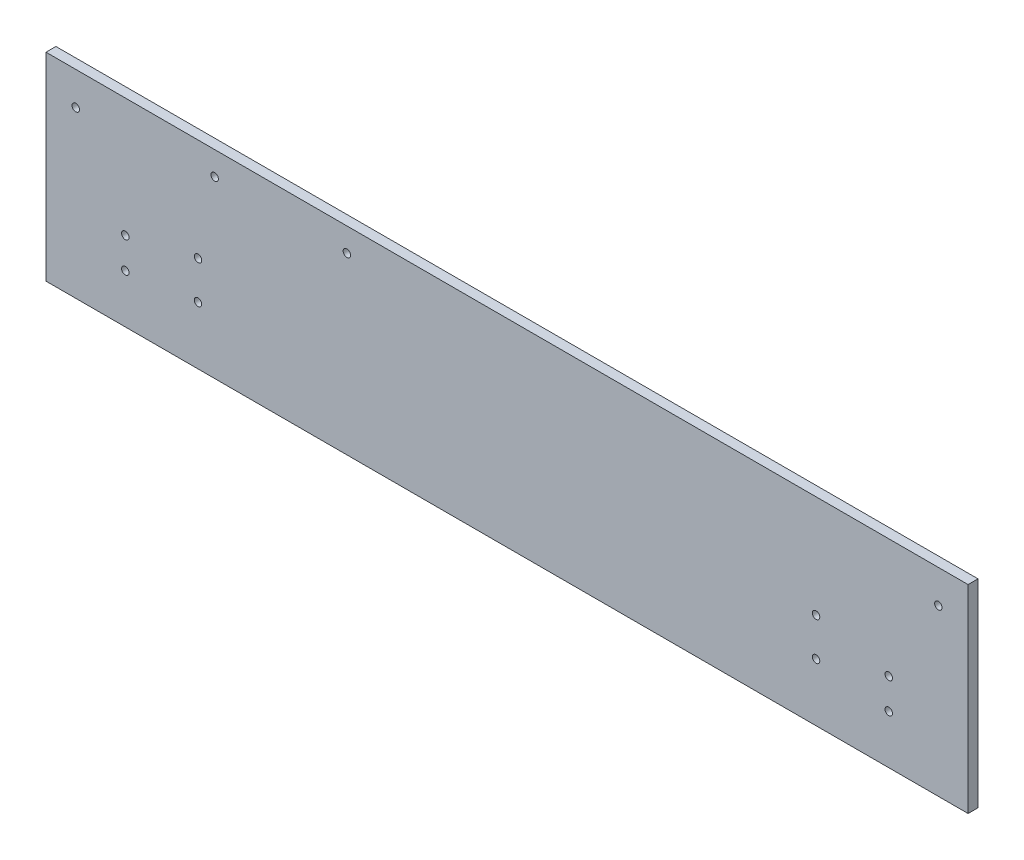
ISO-10303-21;
HEADER;
FILE_DESCRIPTION(('STEP AP214'),'2;1');
FILE_NAME('part.step','',(''),(''),'','','');
FILE_SCHEMA(('AUTOMOTIVE_DESIGN { 1 0 10303 214 1 1 1 1 }'));
ENDSEC;
DATA;
#1=APPLICATION_CONTEXT('core data for automotive mechanical design processes');
#2=APPLICATION_PROTOCOL_DEFINITION('international standard','automotive_design',2000,#1);
#3=PRODUCT_CONTEXT('',#1,'mechanical');
#4=PRODUCT('Part','Part','',(#3));
#5=PRODUCT_RELATED_PRODUCT_CATEGORY('part','',(#4));
#6=PRODUCT_DEFINITION_FORMATION('','',#4);
#7=PRODUCT_DEFINITION_CONTEXT('part definition',#1,'design');
#8=PRODUCT_DEFINITION('design','',#6,#7);
#9=PRODUCT_DEFINITION_SHAPE('','',#8);
#10=(LENGTH_UNIT() NAMED_UNIT(*) SI_UNIT(.MILLI.,.METRE.));
#11=(NAMED_UNIT(*) PLANE_ANGLE_UNIT() SI_UNIT($,.RADIAN.));
#12=(NAMED_UNIT(*) SI_UNIT($,.STERADIAN.) SOLID_ANGLE_UNIT());
#13=UNCERTAINTY_MEASURE_WITH_UNIT(LENGTH_MEASURE(1.E-05),#10,'distance_accuracy_value','');
#14=(GEOMETRIC_REPRESENTATION_CONTEXT(3) GLOBAL_UNCERTAINTY_ASSIGNED_CONTEXT((#13)) GLOBAL_UNIT_ASSIGNED_CONTEXT((#10,
#11,#12)) REPRESENTATION_CONTEXT('',''));
#15=CARTESIAN_POINT('',(0.,0.,0.));
#16=DIRECTION('',(0.,0.,1.));
#17=DIRECTION('',(1.,0.,0.));
#18=AXIS2_PLACEMENT_3D('',#15,#16,#17);
#19=CARTESIAN_POINT('',(-279.,60.,6.));
#20=DIRECTION('',(1.,0.,0.));
#21=DIRECTION('',(0.,0.,-1.));
#22=AXIS2_PLACEMENT_3D('',#19,#20,#21);
#23=PLANE('',#22);
#24=DIRECTION('',(0.,-1.,0.));
#25=VECTOR('',#24,1.);
#26=CARTESIAN_POINT('',(-279.,60.,0.));
#27=LINE('',#26,#25);
#28=CARTESIAN_POINT('',(-279.,60.,0.));
#29=VERTEX_POINT('',#28);
#30=CARTESIAN_POINT('',(-279.,-60.,0.));
#31=VERTEX_POINT('',#30);
#32=EDGE_CURVE('E100',#29,#31,#27,.T.);
#33=ORIENTED_EDGE('',*,*,#32,.T.);
#34=DIRECTION('',(0.,0.,-1.));
#35=VECTOR('',#34,1.);
#36=CARTESIAN_POINT('',(-279.,-60.,6.));
#37=LINE('',#36,#35);
#38=CARTESIAN_POINT('',(-279.,-60.,6.));
#39=VERTEX_POINT('',#38);
#40=EDGE_CURVE('E11',#39,#31,#37,.T.);
#41=ORIENTED_EDGE('',*,*,#40,.F.);
#42=DIRECTION('',(0.,-1.,0.));
#43=VECTOR('',#42,1.);
#44=CARTESIAN_POINT('',(-279.,60.,6.));
#45=LINE('',#44,#43);
#46=CARTESIAN_POINT('',(-279.,60.,6.));
#47=VERTEX_POINT('',#46);
#48=EDGE_CURVE('E88',#47,#39,#45,.T.);
#49=ORIENTED_EDGE('',*,*,#48,.F.);
#50=DIRECTION('',(0.,0.,-1.));
#51=VECTOR('',#50,1.);
#52=CARTESIAN_POINT('',(-279.,60.,6.));
#53=LINE('',#52,#51);
#54=EDGE_CURVE('E96',#47,#29,#53,.T.);
#55=ORIENTED_EDGE('',*,*,#54,.T.);
#56=EDGE_LOOP('',(#33,#41,#49,#55));
#57=FACE_BOUND('',#56,.T.);
#58=ADVANCED_FACE('F37',(#57),#23,.F.);
#59=CARTESIAN_POINT('',(-279.,-60.,6.));
#60=DIRECTION('',(0.,1.,0.));
#61=DIRECTION('',(0.,0.,1.));
#62=AXIS2_PLACEMENT_3D('',#59,#60,#61);
#63=PLANE('',#62);
#64=DIRECTION('',(1.,0.,0.));
#65=VECTOR('',#64,1.);
#66=CARTESIAN_POINT('',(-279.,-60.,0.));
#67=LINE('',#66,#65);
#68=CARTESIAN_POINT('',(279.,-60.,0.));
#69=VERTEX_POINT('',#68);
#70=EDGE_CURVE('E92',#31,#69,#67,.T.);
#71=ORIENTED_EDGE('',*,*,#70,.T.);
#72=DIRECTION('',(0.,0.,-1.));
#73=VECTOR('',#72,1.);
#74=CARTESIAN_POINT('',(279.,-60.,6.));
#75=LINE('',#74,#73);
#76=CARTESIAN_POINT('',(279.,-60.,6.));
#77=VERTEX_POINT('',#76);
#78=EDGE_CURVE('E45',#77,#69,#75,.T.);
#79=ORIENTED_EDGE('',*,*,#78,.F.);
#80=DIRECTION('',(1.,0.,0.));
#81=VECTOR('',#80,1.);
#82=CARTESIAN_POINT('',(-279.,-60.,6.));
#83=LINE('',#82,#81);
#84=EDGE_CURVE('E83',#39,#77,#83,.T.);
#85=ORIENTED_EDGE('',*,*,#84,.F.);
#86=ORIENTED_EDGE('',*,*,#40,.T.);
#87=EDGE_LOOP('',(#71,#79,#85,#86));
#88=FACE_BOUND('',#87,.T.);
#89=ADVANCED_FACE('F91',(#88),#63,.F.);
#90=CARTESIAN_POINT('',(279.,60.,6.));
#91=DIRECTION('',(-1.,0.,0.));
#92=DIRECTION('',(0.,0.,1.));
#93=AXIS2_PLACEMENT_3D('',#90,#91,#92);
#94=PLANE('',#93);
#95=DIRECTION('',(0.,1.,0.));
#96=VECTOR('',#95,1.);
#97=CARTESIAN_POINT('',(279.,60.,0.));
#98=LINE('',#97,#96);
#99=CARTESIAN_POINT('',(279.,60.,0.));
#100=VERTEX_POINT('',#99);
#101=EDGE_CURVE('E70',#69,#100,#98,.T.);
#102=ORIENTED_EDGE('',*,*,#101,.T.);
#103=DIRECTION('',(0.,0.,-1.));
#104=VECTOR('',#103,1.);
#105=CARTESIAN_POINT('',(279.,60.,6.));
#106=LINE('',#105,#104);
#107=CARTESIAN_POINT('',(279.,60.,6.));
#108=VERTEX_POINT('',#107);
#109=EDGE_CURVE('E93',#108,#100,#106,.T.);
#110=ORIENTED_EDGE('',*,*,#109,.F.);
#111=DIRECTION('',(0.,1.,0.));
#112=VECTOR('',#111,1.);
#113=CARTESIAN_POINT('',(279.,60.,6.));
#114=LINE('',#113,#112);
#115=EDGE_CURVE('E86',#77,#108,#114,.T.);
#116=ORIENTED_EDGE('',*,*,#115,.F.);
#117=ORIENTED_EDGE('',*,*,#78,.T.);
#118=EDGE_LOOP('',(#102,#110,#116,#117));
#119=FACE_BOUND('',#118,.T.);
#120=ADVANCED_FACE('F94',(#119),#94,.F.);
#121=CARTESIAN_POINT('',(-279.,60.,6.));
#122=DIRECTION('',(0.,-1.,0.));
#123=DIRECTION('',(0.,0.,-1.));
#124=AXIS2_PLACEMENT_3D('',#121,#122,#123);
#125=PLANE('',#124);
#126=DIRECTION('',(-1.,0.,0.));
#127=VECTOR('',#126,1.);
#128=CARTESIAN_POINT('',(-279.,60.,0.));
#129=LINE('',#128,#127);
#130=EDGE_CURVE('E76',#100,#29,#129,.T.);
#131=ORIENTED_EDGE('',*,*,#130,.T.);
#132=ORIENTED_EDGE('',*,*,#54,.F.);
#133=DIRECTION('',(-1.,0.,0.));
#134=VECTOR('',#133,1.);
#135=CARTESIAN_POINT('',(-279.,60.,6.));
#136=LINE('',#135,#134);
#137=EDGE_CURVE('E53',#108,#47,#136,.T.);
#138=ORIENTED_EDGE('',*,*,#137,.F.);
#139=ORIENTED_EDGE('',*,*,#109,.T.);
#140=EDGE_LOOP('',(#131,#132,#138,#139));
#141=FACE_BOUND('',#140,.T.);
#142=ADVANCED_FACE('F108',(#141),#125,.F.);
#143=CARTESIAN_POINT('',(0.,0.,6.));
#144=DIRECTION('',(0.,0.,1.));
#145=DIRECTION('',(1.,0.,0.));
#146=AXIS2_PLACEMENT_3D('',#143,#144,#145);
#147=PLANE('',#146);
#148=CARTESIAN_POINT('',(-261.,40.,6.));
#149=DIRECTION('',(0.,0.,1.));
#150=DIRECTION('',(1.,0.,0.));
#151=AXIS2_PLACEMENT_3D('',#148,#149,#150);
#152=CIRCLE('',#151,2.24999999999995);
#153=CARTESIAN_POINT('',(-258.75,40.,6.));
#154=VERTEX_POINT('',#153);
#155=EDGE_CURVE('E103',#154,#154,#152,.T.);
#156=ORIENTED_EDGE('',*,*,#155,.F.);
#157=EDGE_LOOP('',(#156));
#158=FACE_BOUND('',#157,.T.);
#159=CARTESIAN_POINT('',(187.,-25.,6.));
#160=DIRECTION('',(0.,0.,1.));
#161=DIRECTION('',(1.,0.,0.));
#162=AXIS2_PLACEMENT_3D('',#159,#160,#161);
#163=CIRCLE('',#162,2.25000000000001);
#164=CARTESIAN_POINT('',(189.25,-25.,6.));
#165=VERTEX_POINT('',#164);
#166=EDGE_CURVE('E116',#165,#165,#163,.T.);
#167=ORIENTED_EDGE('',*,*,#166,.F.);
#168=EDGE_LOOP('',(#167));
#169=FACE_BOUND('',#168,.T.);
#170=CARTESIAN_POINT('',(187.,-2.,6.));
#171=DIRECTION('',(0.,0.,1.));
#172=DIRECTION('',(1.,0.,0.));
#173=AXIS2_PLACEMENT_3D('',#170,#171,#172);
#174=CIRCLE('',#173,2.25000000000001);
#175=CARTESIAN_POINT('',(189.25,-2.,6.));
#176=VERTEX_POINT('',#175);
#177=EDGE_CURVE('E119',#176,#176,#174,.T.);
#178=ORIENTED_EDGE('',*,*,#177,.F.);
#179=EDGE_LOOP('',(#178));
#180=FACE_BOUND('',#179,.T.);
#181=CARTESIAN_POINT('',(-187.,-25.,6.));
#182=DIRECTION('',(0.,0.,1.));
#183=DIRECTION('',(1.,0.,0.));
#184=AXIS2_PLACEMENT_3D('',#181,#182,#183);
#185=CIRCLE('',#184,2.25000000000001);
#186=CARTESIAN_POINT('',(-184.75,-25.,6.));
#187=VERTEX_POINT('',#186);
#188=EDGE_CURVE('E122',#187,#187,#185,.T.);
#189=ORIENTED_EDGE('',*,*,#188,.F.);
#190=EDGE_LOOP('',(#189));
#191=FACE_BOUND('',#190,.T.);
#192=CARTESIAN_POINT('',(231.,-30.5,6.));
#193=DIRECTION('',(0.,0.,1.));
#194=DIRECTION('',(1.,0.,0.));
#195=AXIS2_PLACEMENT_3D('',#192,#193,#194);
#196=CIRCLE('',#195,2.25000000000001);
#197=CARTESIAN_POINT('',(233.25,-30.5,6.));
#198=VERTEX_POINT('',#197);
#199=EDGE_CURVE('E125',#198,#198,#196,.T.);
#200=ORIENTED_EDGE('',*,*,#199,.F.);
#201=EDGE_LOOP('',(#200));
#202=FACE_BOUND('',#201,.T.);
#203=CARTESIAN_POINT('',(-231.,-12.,6.));
#204=DIRECTION('',(0.,0.,1.));
#205=DIRECTION('',(1.,0.,0.));
#206=AXIS2_PLACEMENT_3D('',#203,#204,#205);
#207=CIRCLE('',#206,2.25000000000001);
#208=CARTESIAN_POINT('',(-228.75,-12.,6.));
#209=VERTEX_POINT('',#208);
#210=EDGE_CURVE('E128',#209,#209,#207,.T.);
#211=ORIENTED_EDGE('',*,*,#210,.F.);
#212=EDGE_LOOP('',(#211));
#213=FACE_BOUND('',#212,.T.);
#214=CARTESIAN_POINT('',(-231.,-30.5,6.));
#215=DIRECTION('',(0.,0.,1.));
#216=DIRECTION('',(1.,0.,0.));
#217=AXIS2_PLACEMENT_3D('',#214,#215,#216);
#218=CIRCLE('',#217,2.25000000000001);
#219=CARTESIAN_POINT('',(-228.75,-30.5,6.));
#220=VERTEX_POINT('',#219);
#221=EDGE_CURVE('E131',#220,#220,#218,.T.);
#222=ORIENTED_EDGE('',*,*,#221,.F.);
#223=EDGE_LOOP('',(#222));
#224=FACE_BOUND('',#223,.T.);
#225=CARTESIAN_POINT('',(261.,40.,6.));
#226=DIRECTION('',(0.,0.,1.));
#227=DIRECTION('',(1.,0.,0.));
#228=AXIS2_PLACEMENT_3D('',#225,#226,#227);
#229=CIRCLE('',#228,2.24999999999995);
#230=CARTESIAN_POINT('',(263.25,40.,6.));
#231=VERTEX_POINT('',#230);
#232=EDGE_CURVE('E134',#231,#231,#229,.T.);
#233=ORIENTED_EDGE('',*,*,#232,.F.);
#234=EDGE_LOOP('',(#233));
#235=FACE_BOUND('',#234,.T.);
#236=CARTESIAN_POINT('',(-176.925688,45.6999999999998,6.));
#237=DIRECTION('',(0.,0.,1.));
#238=DIRECTION('',(1.,0.,0.));
#239=AXIS2_PLACEMENT_3D('',#236,#237,#238);
#240=CIRCLE('',#239,2.25000000000001);
#241=CARTESIAN_POINT('',(-174.675688,45.6999999999998,6.));
#242=VERTEX_POINT('',#241);
#243=EDGE_CURVE('E137',#242,#242,#240,.T.);
#244=ORIENTED_EDGE('',*,*,#243,.F.);
#245=EDGE_LOOP('',(#244));
#246=FACE_BOUND('',#245,.T.);
#247=CARTESIAN_POINT('',(-96.925688,45.6999999999998,6.));
#248=DIRECTION('',(0.,0.,1.));
#249=DIRECTION('',(1.,0.,0.));
#250=AXIS2_PLACEMENT_3D('',#247,#248,#249);
#251=CIRCLE('',#250,2.25);
#252=CARTESIAN_POINT('',(-94.675688,45.6999999999998,6.));
#253=VERTEX_POINT('',#252);
#254=EDGE_CURVE('E140',#253,#253,#251,.T.);
#255=ORIENTED_EDGE('',*,*,#254,.F.);
#256=EDGE_LOOP('',(#255));
#257=FACE_BOUND('',#256,.T.);
#258=CARTESIAN_POINT('',(-187.,-2.,6.));
#259=DIRECTION('',(0.,0.,1.));
#260=DIRECTION('',(1.,0.,0.));
#261=AXIS2_PLACEMENT_3D('',#258,#259,#260);
#262=CIRCLE('',#261,2.25000000000001);
#263=CARTESIAN_POINT('',(-184.75,-2.,6.));
#264=VERTEX_POINT('',#263);
#265=EDGE_CURVE('E143',#264,#264,#262,.T.);
#266=ORIENTED_EDGE('',*,*,#265,.F.);
#267=EDGE_LOOP('',(#266));
#268=FACE_BOUND('',#267,.T.);
#269=CARTESIAN_POINT('',(231.,-12.,6.));
#270=DIRECTION('',(0.,0.,1.));
#271=DIRECTION('',(1.,0.,0.));
#272=AXIS2_PLACEMENT_3D('',#269,#270,#271);
#273=CIRCLE('',#272,2.25000000000001);
#274=CARTESIAN_POINT('',(233.25,-12.,6.));
#275=VERTEX_POINT('',#274);
#276=EDGE_CURVE('E146',#275,#275,#273,.T.);
#277=ORIENTED_EDGE('',*,*,#276,.F.);
#278=EDGE_LOOP('',(#277));
#279=FACE_BOUND('',#278,.T.);
#280=ORIENTED_EDGE('',*,*,#48,.T.);
#281=ORIENTED_EDGE('',*,*,#84,.T.);
#282=ORIENTED_EDGE('',*,*,#115,.T.);
#283=ORIENTED_EDGE('',*,*,#137,.T.);
#284=EDGE_LOOP('',(#280,#281,#282,#283));
#285=FACE_BOUND('',#284,.T.);
#286=ADVANCED_FACE('F84',(#158,#169,#180,#191,#202,#213,#224,#235,#246,#257,#268,#279,#285),
#147,.T.);
#287=CARTESIAN_POINT('',(0.,0.,0.));
#288=DIRECTION('',(0.,0.,1.));
#289=DIRECTION('',(1.,0.,0.));
#290=AXIS2_PLACEMENT_3D('',#287,#288,#289);
#291=PLANE('',#290);
#292=CARTESIAN_POINT('',(-261.,40.,0.));
#293=DIRECTION('',(0.,0.,-1.));
#294=DIRECTION('',(-1.,0.,0.));
#295=AXIS2_PLACEMENT_3D('',#292,#293,#294);
#296=CIRCLE('',#295,2.24999999999995);
#297=CARTESIAN_POINT('',(-263.25,40.,0.));
#298=VERTEX_POINT('',#297);
#299=EDGE_CURVE('E162',#298,#298,#296,.T.);
#300=ORIENTED_EDGE('',*,*,#299,.F.);
#301=EDGE_LOOP('',(#300));
#302=FACE_BOUND('',#301,.T.);
#303=CARTESIAN_POINT('',(187.,-25.,0.));
#304=DIRECTION('',(0.,0.,-1.));
#305=DIRECTION('',(-1.,0.,0.));
#306=AXIS2_PLACEMENT_3D('',#303,#304,#305);
#307=CIRCLE('',#306,2.25000000000001);
#308=CARTESIAN_POINT('',(184.75,-25.,0.));
#309=VERTEX_POINT('',#308);
#310=EDGE_CURVE('E165',#309,#309,#307,.T.);
#311=ORIENTED_EDGE('',*,*,#310,.F.);
#312=EDGE_LOOP('',(#311));
#313=FACE_BOUND('',#312,.T.);
#314=CARTESIAN_POINT('',(187.,-2.,0.));
#315=DIRECTION('',(0.,0.,-1.));
#316=DIRECTION('',(-1.,0.,0.));
#317=AXIS2_PLACEMENT_3D('',#314,#315,#316);
#318=CIRCLE('',#317,2.25000000000001);
#319=CARTESIAN_POINT('',(184.75,-2.,0.));
#320=VERTEX_POINT('',#319);
#321=EDGE_CURVE('E168',#320,#320,#318,.T.);
#322=ORIENTED_EDGE('',*,*,#321,.F.);
#323=EDGE_LOOP('',(#322));
#324=FACE_BOUND('',#323,.T.);
#325=CARTESIAN_POINT('',(-187.,-25.,0.));
#326=DIRECTION('',(0.,0.,-1.));
#327=DIRECTION('',(-1.,0.,0.));
#328=AXIS2_PLACEMENT_3D('',#325,#326,#327);
#329=CIRCLE('',#328,2.25000000000001);
#330=CARTESIAN_POINT('',(-189.25,-25.,0.));
#331=VERTEX_POINT('',#330);
#332=EDGE_CURVE('E171',#331,#331,#329,.T.);
#333=ORIENTED_EDGE('',*,*,#332,.F.);
#334=EDGE_LOOP('',(#333));
#335=FACE_BOUND('',#334,.T.);
#336=CARTESIAN_POINT('',(231.,-30.5,0.));
#337=DIRECTION('',(0.,0.,-1.));
#338=DIRECTION('',(-1.,0.,0.));
#339=AXIS2_PLACEMENT_3D('',#336,#337,#338);
#340=CIRCLE('',#339,2.25000000000001);
#341=CARTESIAN_POINT('',(228.75,-30.5,0.));
#342=VERTEX_POINT('',#341);
#343=EDGE_CURVE('E152',#342,#342,#340,.T.);
#344=ORIENTED_EDGE('',*,*,#343,.F.);
#345=EDGE_LOOP('',(#344));
#346=FACE_BOUND('',#345,.T.);
#347=CARTESIAN_POINT('',(-231.,-12.,0.));
#348=DIRECTION('',(0.,0.,-1.));
#349=DIRECTION('',(-1.,0.,0.));
#350=AXIS2_PLACEMENT_3D('',#347,#348,#349);
#351=CIRCLE('',#350,2.25000000000001);
#352=CARTESIAN_POINT('',(-233.25,-12.,0.));
#353=VERTEX_POINT('',#352);
#354=EDGE_CURVE('E153',#353,#353,#351,.T.);
#355=ORIENTED_EDGE('',*,*,#354,.F.);
#356=EDGE_LOOP('',(#355));
#357=FACE_BOUND('',#356,.T.);
#358=CARTESIAN_POINT('',(-231.,-30.5,0.));
#359=DIRECTION('',(0.,0.,-1.));
#360=DIRECTION('',(-1.,0.,0.));
#361=AXIS2_PLACEMENT_3D('',#358,#359,#360);
#362=CIRCLE('',#361,2.25000000000001);
#363=CARTESIAN_POINT('',(-233.25,-30.5,0.));
#364=VERTEX_POINT('',#363);
#365=EDGE_CURVE('E156',#364,#364,#362,.T.);
#366=ORIENTED_EDGE('',*,*,#365,.F.);
#367=EDGE_LOOP('',(#366));
#368=FACE_BOUND('',#367,.T.);
#369=CARTESIAN_POINT('',(261.,40.,0.));
#370=DIRECTION('',(0.,0.,-1.));
#371=DIRECTION('',(-1.,0.,0.));
#372=AXIS2_PLACEMENT_3D('',#369,#370,#371);
#373=CIRCLE('',#372,2.24999999999995);
#374=CARTESIAN_POINT('',(258.75,40.,0.));
#375=VERTEX_POINT('',#374);
#376=EDGE_CURVE('E159',#375,#375,#373,.T.);
#377=ORIENTED_EDGE('',*,*,#376,.F.);
#378=EDGE_LOOP('',(#377));
#379=FACE_BOUND('',#378,.T.);
#380=CARTESIAN_POINT('',(-176.925688,45.6999999999998,0.));
#381=DIRECTION('',(0.,0.,-1.));
#382=DIRECTION('',(-1.,0.,0.));
#383=AXIS2_PLACEMENT_3D('',#380,#381,#382);
#384=CIRCLE('',#383,2.25000000000001);
#385=CARTESIAN_POINT('',(-179.175688,45.6999999999998,0.));
#386=VERTEX_POINT('',#385);
#387=EDGE_CURVE('E180',#386,#386,#384,.T.);
#388=ORIENTED_EDGE('',*,*,#387,.F.);
#389=EDGE_LOOP('',(#388));
#390=FACE_BOUND('',#389,.T.);
#391=CARTESIAN_POINT('',(-96.925688,45.6999999999998,0.));
#392=DIRECTION('',(0.,0.,-1.));
#393=DIRECTION('',(-1.,0.,0.));
#394=AXIS2_PLACEMENT_3D('',#391,#392,#393);
#395=CIRCLE('',#394,2.25);
#396=CARTESIAN_POINT('',(-99.175688,45.6999999999998,0.));
#397=VERTEX_POINT('',#396);
#398=EDGE_CURVE('E177',#397,#397,#395,.T.);
#399=ORIENTED_EDGE('',*,*,#398,.F.);
#400=EDGE_LOOP('',(#399));
#401=FACE_BOUND('',#400,.T.);
#402=CARTESIAN_POINT('',(-187.,-2.,0.));
#403=DIRECTION('',(0.,0.,-1.));
#404=DIRECTION('',(-1.,0.,0.));
#405=AXIS2_PLACEMENT_3D('',#402,#403,#404);
#406=CIRCLE('',#405,2.25000000000001);
#407=CARTESIAN_POINT('',(-189.25,-2.,0.));
#408=VERTEX_POINT('',#407);
#409=EDGE_CURVE('E174',#408,#408,#406,.T.);
#410=ORIENTED_EDGE('',*,*,#409,.F.);
#411=EDGE_LOOP('',(#410));
#412=FACE_BOUND('',#411,.T.);
#413=CARTESIAN_POINT('',(231.,-12.,0.));
#414=DIRECTION('',(0.,0.,-1.));
#415=DIRECTION('',(-1.,0.,0.));
#416=AXIS2_PLACEMENT_3D('',#413,#414,#415);
#417=CIRCLE('',#416,2.25000000000001);
#418=CARTESIAN_POINT('',(228.75,-12.,0.));
#419=VERTEX_POINT('',#418);
#420=EDGE_CURVE('E149',#419,#419,#417,.T.);
#421=ORIENTED_EDGE('',*,*,#420,.F.);
#422=EDGE_LOOP('',(#421));
#423=FACE_BOUND('',#422,.T.);
#424=ORIENTED_EDGE('',*,*,#32,.F.);
#425=ORIENTED_EDGE('',*,*,#130,.F.);
#426=ORIENTED_EDGE('',*,*,#101,.F.);
#427=ORIENTED_EDGE('',*,*,#70,.F.);
#428=EDGE_LOOP('',(#424,#425,#426,#427));
#429=FACE_BOUND('',#428,.T.);
#430=ADVANCED_FACE('F111',(#302,#313,#324,#335,#346,#357,#368,#379,#390,#401,#412,#423,#429),
#291,.F.);
#431=CARTESIAN_POINT('',(231.,-12.,10.));
#432=DIRECTION('',(0.,0.,-1.));
#433=DIRECTION('',(-1.,0.,0.));
#434=AXIS2_PLACEMENT_3D('',#431,#432,#433);
#435=CYLINDRICAL_SURFACE('',#434,2.25000000000001);
#436=ORIENTED_EDGE('',*,*,#276,.T.);
#437=EDGE_LOOP('',(#436));
#438=FACE_BOUND('',#437,.T.);
#439=ORIENTED_EDGE('',*,*,#420,.T.);
#440=EDGE_LOOP('',(#439));
#441=FACE_BOUND('',#440,.T.);
#442=ADVANCED_FACE('F190',(#438,#441),#435,.F.);
#443=CARTESIAN_POINT('',(-187.,-2.,10.));
#444=DIRECTION('',(0.,0.,-1.));
#445=DIRECTION('',(-1.,0.,0.));
#446=AXIS2_PLACEMENT_3D('',#443,#444,#445);
#447=CYLINDRICAL_SURFACE('',#446,2.25000000000001);
#448=ORIENTED_EDGE('',*,*,#265,.T.);
#449=EDGE_LOOP('',(#448));
#450=FACE_BOUND('',#449,.T.);
#451=ORIENTED_EDGE('',*,*,#409,.T.);
#452=EDGE_LOOP('',(#451));
#453=FACE_BOUND('',#452,.T.);
#454=ADVANCED_FACE('F200',(#450,#453),#447,.F.);
#455=CARTESIAN_POINT('',(-96.925688,45.6999999999998,10.));
#456=DIRECTION('',(0.,0.,-1.));
#457=DIRECTION('',(-1.,0.,0.));
#458=AXIS2_PLACEMENT_3D('',#455,#456,#457);
#459=CYLINDRICAL_SURFACE('',#458,2.25);
#460=ORIENTED_EDGE('',*,*,#254,.T.);
#461=EDGE_LOOP('',(#460));
#462=FACE_BOUND('',#461,.T.);
#463=ORIENTED_EDGE('',*,*,#398,.T.);
#464=EDGE_LOOP('',(#463));
#465=FACE_BOUND('',#464,.T.);
#466=ADVANCED_FACE('F206',(#462,#465),#459,.F.);
#467=CARTESIAN_POINT('',(-176.925688,45.6999999999998,10.));
#468=DIRECTION('',(0.,0.,-1.));
#469=DIRECTION('',(-1.,0.,0.));
#470=AXIS2_PLACEMENT_3D('',#467,#468,#469);
#471=CYLINDRICAL_SURFACE('',#470,2.25000000000001);
#472=ORIENTED_EDGE('',*,*,#243,.T.);
#473=EDGE_LOOP('',(#472));
#474=FACE_BOUND('',#473,.T.);
#475=ORIENTED_EDGE('',*,*,#387,.T.);
#476=EDGE_LOOP('',(#475));
#477=FACE_BOUND('',#476,.T.);
#478=ADVANCED_FACE('F186',(#474,#477),#471,.F.);
#479=CARTESIAN_POINT('',(261.,40.,10.));
#480=DIRECTION('',(0.,0.,-1.));
#481=DIRECTION('',(-1.,0.,0.));
#482=AXIS2_PLACEMENT_3D('',#479,#480,#481);
#483=CYLINDRICAL_SURFACE('',#482,2.24999999999995);
#484=ORIENTED_EDGE('',*,*,#232,.T.);
#485=EDGE_LOOP('',(#484));
#486=FACE_BOUND('',#485,.T.);
#487=ORIENTED_EDGE('',*,*,#376,.T.);
#488=EDGE_LOOP('',(#487));
#489=FACE_BOUND('',#488,.T.);
#490=ADVANCED_FACE('F256',(#486,#489),#483,.F.);
#491=CARTESIAN_POINT('',(-231.,-30.5,10.));
#492=DIRECTION('',(0.,0.,-1.));
#493=DIRECTION('',(-1.,0.,0.));
#494=AXIS2_PLACEMENT_3D('',#491,#492,#493);
#495=CYLINDRICAL_SURFACE('',#494,2.25000000000001);
#496=ORIENTED_EDGE('',*,*,#221,.T.);
#497=EDGE_LOOP('',(#496));
#498=FACE_BOUND('',#497,.T.);
#499=ORIENTED_EDGE('',*,*,#365,.T.);
#500=EDGE_LOOP('',(#499));
#501=FACE_BOUND('',#500,.T.);
#502=ADVANCED_FACE('F277',(#498,#501),#495,.F.);
#503=CARTESIAN_POINT('',(-231.,-12.,10.));
#504=DIRECTION('',(0.,0.,-1.));
#505=DIRECTION('',(-1.,0.,0.));
#506=AXIS2_PLACEMENT_3D('',#503,#504,#505);
#507=CYLINDRICAL_SURFACE('',#506,2.25000000000001);
#508=ORIENTED_EDGE('',*,*,#210,.T.);
#509=EDGE_LOOP('',(#508));
#510=FACE_BOUND('',#509,.T.);
#511=ORIENTED_EDGE('',*,*,#354,.T.);
#512=EDGE_LOOP('',(#511));
#513=FACE_BOUND('',#512,.T.);
#514=ADVANCED_FACE('F280',(#510,#513),#507,.F.);
#515=CARTESIAN_POINT('',(231.,-30.5,10.));
#516=DIRECTION('',(0.,0.,-1.));
#517=DIRECTION('',(-1.,0.,0.));
#518=AXIS2_PLACEMENT_3D('',#515,#516,#517);
#519=CYLINDRICAL_SURFACE('',#518,2.25000000000001);
#520=ORIENTED_EDGE('',*,*,#199,.T.);
#521=EDGE_LOOP('',(#520));
#522=FACE_BOUND('',#521,.T.);
#523=ORIENTED_EDGE('',*,*,#343,.T.);
#524=EDGE_LOOP('',(#523));
#525=FACE_BOUND('',#524,.T.);
#526=ADVANCED_FACE('F268',(#522,#525),#519,.F.);
#527=CARTESIAN_POINT('',(-187.,-25.,10.));
#528=DIRECTION('',(0.,0.,-1.));
#529=DIRECTION('',(-1.,0.,0.));
#530=AXIS2_PLACEMENT_3D('',#527,#528,#529);
#531=CYLINDRICAL_SURFACE('',#530,2.25000000000001);
#532=ORIENTED_EDGE('',*,*,#188,.T.);
#533=EDGE_LOOP('',(#532));
#534=FACE_BOUND('',#533,.T.);
#535=ORIENTED_EDGE('',*,*,#332,.T.);
#536=EDGE_LOOP('',(#535));
#537=FACE_BOUND('',#536,.T.);
#538=ADVANCED_FACE('F264',(#534,#537),#531,.F.);
#539=CARTESIAN_POINT('',(187.,-2.,10.));
#540=DIRECTION('',(0.,0.,-1.));
#541=DIRECTION('',(-1.,0.,0.));
#542=AXIS2_PLACEMENT_3D('',#539,#540,#541);
#543=CYLINDRICAL_SURFACE('',#542,2.25000000000001);
#544=ORIENTED_EDGE('',*,*,#177,.T.);
#545=EDGE_LOOP('',(#544));
#546=FACE_BOUND('',#545,.T.);
#547=ORIENTED_EDGE('',*,*,#321,.T.);
#548=EDGE_LOOP('',(#547));
#549=FACE_BOUND('',#548,.T.);
#550=ADVANCED_FACE('F260',(#546,#549),#543,.F.);
#551=CARTESIAN_POINT('',(187.,-25.,10.));
#552=DIRECTION('',(0.,0.,-1.));
#553=DIRECTION('',(-1.,0.,0.));
#554=AXIS2_PLACEMENT_3D('',#551,#552,#553);
#555=CYLINDRICAL_SURFACE('',#554,2.25000000000001);
#556=ORIENTED_EDGE('',*,*,#166,.T.);
#557=EDGE_LOOP('',(#556));
#558=FACE_BOUND('',#557,.T.);
#559=ORIENTED_EDGE('',*,*,#310,.T.);
#560=EDGE_LOOP('',(#559));
#561=FACE_BOUND('',#560,.T.);
#562=ADVANCED_FACE('F263',(#558,#561),#555,.F.);
#563=CARTESIAN_POINT('',(-261.,40.,10.));
#564=DIRECTION('',(0.,0.,-1.));
#565=DIRECTION('',(-1.,0.,0.));
#566=AXIS2_PLACEMENT_3D('',#563,#564,#565);
#567=CYLINDRICAL_SURFACE('',#566,2.24999999999995);
#568=ORIENTED_EDGE('',*,*,#155,.T.);
#569=EDGE_LOOP('',(#568));
#570=FACE_BOUND('',#569,.T.);
#571=ORIENTED_EDGE('',*,*,#299,.T.);
#572=EDGE_LOOP('',(#571));
#573=FACE_BOUND('',#572,.T.);
#574=ADVANCED_FACE('F270',(#570,#573),#567,.F.);
#575=CLOSED_SHELL('',(#58,#89,#120,#142,#286,#430,#442,#454,#466,#478,#490,#502,#514,#526,#538,
#550,#562,#574));
#576=MANIFOLD_SOLID_BREP('B2',#575);
#577=ADVANCED_BREP_SHAPE_REPRESENTATION('',(#18,#576),#14);
#578=SHAPE_DEFINITION_REPRESENTATION(#9,#577);
ENDSEC;
END-ISO-10303-21;
